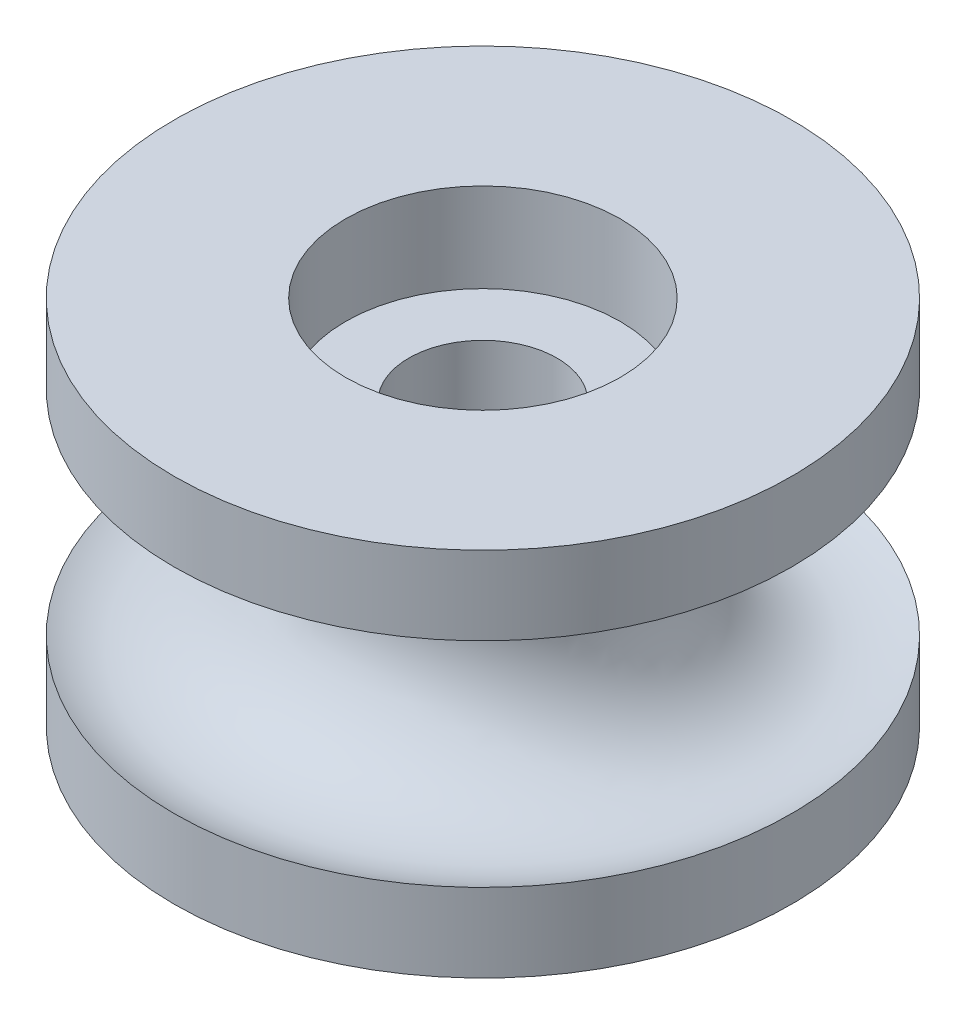
ISO-10303-21;
HEADER;
FILE_DESCRIPTION(('STEP AP214'),'2;1');
FILE_NAME('part.step','',(''),(''),'','','');
FILE_SCHEMA(('AUTOMOTIVE_DESIGN { 1 0 10303 214 1 1 1 1 }'));
ENDSEC;
DATA;
#1=APPLICATION_CONTEXT('core data for automotive mechanical design processes');
#2=APPLICATION_PROTOCOL_DEFINITION('international standard','automotive_design',2000,#1);
#3=PRODUCT_CONTEXT('',#1,'mechanical');
#4=PRODUCT('Part','Part','',(#3));
#5=PRODUCT_RELATED_PRODUCT_CATEGORY('part','',(#4));
#6=PRODUCT_DEFINITION_FORMATION('','',#4);
#7=PRODUCT_DEFINITION_CONTEXT('part definition',#1,'design');
#8=PRODUCT_DEFINITION('design','',#6,#7);
#9=PRODUCT_DEFINITION_SHAPE('','',#8);
#10=(LENGTH_UNIT() NAMED_UNIT(*) SI_UNIT(.MILLI.,.METRE.));
#11=(NAMED_UNIT(*) PLANE_ANGLE_UNIT() SI_UNIT($,.RADIAN.));
#12=(NAMED_UNIT(*) SI_UNIT($,.STERADIAN.) SOLID_ANGLE_UNIT());
#13=UNCERTAINTY_MEASURE_WITH_UNIT(LENGTH_MEASURE(1.E-05),#10,'distance_accuracy_value','');
#14=(GEOMETRIC_REPRESENTATION_CONTEXT(3) GLOBAL_UNCERTAINTY_ASSIGNED_CONTEXT((#13)) GLOBAL_UNIT_ASSIGNED_CONTEXT((#10,
#11,#12)) REPRESENTATION_CONTEXT('',''));
#15=CARTESIAN_POINT('',(0.,0.,0.));
#16=DIRECTION('',(0.,0.,1.));
#17=DIRECTION('',(1.,0.,0.));
#18=AXIS2_PLACEMENT_3D('',#15,#16,#17);
#19=CARTESIAN_POINT('',(0.,-15.,0.));
#20=DIRECTION('',(0.,1.,0.));
#21=DIRECTION('',(0.,0.,1.));
#22=AXIS2_PLACEMENT_3D('',#19,#20,#21);
#23=CYLINDRICAL_SURFACE('',#22,6.);
#24=CARTESIAN_POINT('',(0.,-7.8,0.));
#25=DIRECTION('',(0.,1.,0.));
#26=DIRECTION('',(0.,0.,1.));
#27=AXIS2_PLACEMENT_3D('',#24,#25,#26);
#28=CIRCLE('',#27,6.);
#29=CARTESIAN_POINT('',(0.,-7.8,6.));
#30=VERTEX_POINT('',#29);
#31=EDGE_CURVE('E35',#30,#30,#28,.F.);
#32=ORIENTED_EDGE('',*,*,#31,.T.);
#33=EDGE_LOOP('',(#32));
#34=FACE_BOUND('',#33,.T.);
#35=CARTESIAN_POINT('',(0.,7.8,0.));
#36=DIRECTION('',(0.,1.,0.));
#37=DIRECTION('',(0.,0.,1.));
#38=AXIS2_PLACEMENT_3D('',#35,#36,#37);
#39=CIRCLE('',#38,6.);
#40=CARTESIAN_POINT('',(0.,7.8,6.));
#41=VERTEX_POINT('',#40);
#42=EDGE_CURVE('E51',#41,#41,#39,.F.);
#43=ORIENTED_EDGE('',*,*,#42,.F.);
#44=EDGE_LOOP('',(#43));
#45=FACE_BOUND('',#44,.T.);
#46=ADVANCED_FACE('F31',(#34,#45),#23,.F.);
#47=CARTESIAN_POINT('',(0.,-15.,0.));
#48=DIRECTION('',(0.,1.,0.));
#49=DIRECTION('',(0.,0.,1.));
#50=AXIS2_PLACEMENT_3D('',#47,#48,#49);
#51=CYLINDRICAL_SURFACE('',#50,25.);
#52=CARTESIAN_POINT('',(0.,-8.64439847531337,0.));
#53=DIRECTION('',(0.,1.,0.));
#54=DIRECTION('',(0.,0.,1.));
#55=AXIS2_PLACEMENT_3D('',#52,#53,#54);
#56=CIRCLE('',#55,25.);
#57=CARTESIAN_POINT('',(0.,-8.64439847531337,25.));
#58=VERTEX_POINT('',#57);
#59=EDGE_CURVE('E44',#58,#58,#56,.T.);
#60=ORIENTED_EDGE('',*,*,#59,.F.);
#61=EDGE_LOOP('',(#60));
#62=FACE_BOUND('',#61,.T.);
#63=CARTESIAN_POINT('',(0.,-15.,0.));
#64=DIRECTION('',(0.,1.,0.));
#65=DIRECTION('',(0.,0.,1.));
#66=AXIS2_PLACEMENT_3D('',#63,#64,#65);
#67=CIRCLE('',#66,25.);
#68=CARTESIAN_POINT('',(0.,-15.,25.));
#69=VERTEX_POINT('',#68);
#70=EDGE_CURVE('E10',#69,#69,#67,.T.);
#71=ORIENTED_EDGE('',*,*,#70,.T.);
#72=EDGE_LOOP('',(#71));
#73=FACE_BOUND('',#72,.T.);
#74=ADVANCED_FACE('F91',(#62,#73),#51,.T.);
#75=CARTESIAN_POINT('',(0.,8.64439847531338,0.));
#76=DIRECTION('',(0.,-1.,0.));
#77=DIRECTION('',(0.,0.,-1.));
#78=AXIS2_PLACEMENT_3D('',#75,#76,#77);
#79=CIRCLE('',#78,25.);
#80=CARTESIAN_POINT('',(0.,8.64439847531337,-25.));
#81=VERTEX_POINT('',#80);
#82=EDGE_CURVE('E48',#81,#81,#79,.T.);
#83=ORIENTED_EDGE('',*,*,#82,.F.);
#84=EDGE_LOOP('',(#83));
#85=FACE_BOUND('',#84,.T.);
#86=CARTESIAN_POINT('',(0.,15.,0.));
#87=DIRECTION('',(0.,1.,0.));
#88=DIRECTION('',(0.,0.,1.));
#89=AXIS2_PLACEMENT_3D('',#86,#87,#88);
#90=CIRCLE('',#89,25.);
#91=CARTESIAN_POINT('',(0.,15.,25.));
#92=VERTEX_POINT('',#91);
#93=EDGE_CURVE('E39',#92,#92,#90,.T.);
#94=ORIENTED_EDGE('',*,*,#93,.F.);
#95=EDGE_LOOP('',(#94));
#96=FACE_BOUND('',#95,.T.);
#97=ADVANCED_FACE('F33',(#85,#96),#51,.T.);
#98=CARTESIAN_POINT('',(0.,-15.,0.));
#99=DIRECTION('',(0.,1.,0.));
#100=DIRECTION('',(0.,0.,1.));
#101=AXIS2_PLACEMENT_3D('',#98,#99,#100);
#102=PLANE('',#101);
#103=CARTESIAN_POINT('',(0.,-15.,0.));
#104=DIRECTION('',(0.,1.,0.));
#105=DIRECTION('',(0.,0.,1.));
#106=AXIS2_PLACEMENT_3D('',#103,#104,#105);
#107=CIRCLE('',#106,11.125);
#108=CARTESIAN_POINT('',(0.,-15.,11.125));
#109=VERTEX_POINT('',#108);
#110=EDGE_CURVE('E64',#109,#109,#107,.T.);
#111=ORIENTED_EDGE('',*,*,#110,.T.);
#112=EDGE_LOOP('',(#111));
#113=FACE_BOUND('',#112,.T.);
#114=ORIENTED_EDGE('',*,*,#70,.F.);
#115=EDGE_LOOP('',(#114));
#116=FACE_BOUND('',#115,.T.);
#117=ADVANCED_FACE('F100',(#113,#116),#102,.F.);
#118=CARTESIAN_POINT('',(0.,15.,0.));
#119=DIRECTION('',(0.,1.,0.));
#120=DIRECTION('',(0.,0.,1.));
#121=AXIS2_PLACEMENT_3D('',#118,#119,#120);
#122=PLANE('',#121);
#123=CARTESIAN_POINT('',(0.,15.,0.));
#124=DIRECTION('',(0.,1.,0.));
#125=DIRECTION('',(0.,0.,1.));
#126=AXIS2_PLACEMENT_3D('',#123,#124,#125);
#127=CIRCLE('',#126,11.125);
#128=CARTESIAN_POINT('',(0.,15.,11.125));
#129=VERTEX_POINT('',#128);
#130=EDGE_CURVE('E58',#129,#129,#127,.T.);
#131=ORIENTED_EDGE('',*,*,#130,.F.);
#132=EDGE_LOOP('',(#131));
#133=FACE_BOUND('',#132,.T.);
#134=ORIENTED_EDGE('',*,*,#93,.T.);
#135=EDGE_LOOP('',(#134));
#136=FACE_BOUND('',#135,.T.);
#137=ADVANCED_FACE('F98',(#133,#136),#122,.T.);
#138=CARTESIAN_POINT('',(0.,0.,0.));
#139=DIRECTION('',(0.,-1.,0.));
#140=DIRECTION('',(0.,0.,-1.));
#141=AXIS2_PLACEMENT_3D('',#138,#139,#140);
#142=TOROIDAL_SURFACE('',#141,21.,9.52500000000001);
#143=ORIENTED_EDGE('',*,*,#59,.T.);
#144=EDGE_LOOP('',(#143));
#145=FACE_BOUND('',#144,.T.);
#146=ORIENTED_EDGE('',*,*,#82,.T.);
#147=EDGE_LOOP('',(#146));
#148=FACE_BOUND('',#147,.T.);
#149=ADVANCED_FACE('F107',(#145,#148),#142,.F.);
#150=CARTESIAN_POINT('',(0.,7.8,0.));
#151=DIRECTION('',(0.,1.,0.));
#152=DIRECTION('',(0.,0.,1.));
#153=AXIS2_PLACEMENT_3D('',#150,#151,#152);
#154=PLANE('',#153);
#155=CARTESIAN_POINT('',(0.,7.8,0.));
#156=DIRECTION('',(0.,1.,0.));
#157=DIRECTION('',(0.,0.,1.));
#158=AXIS2_PLACEMENT_3D('',#155,#156,#157);
#159=CIRCLE('',#158,11.125);
#160=CARTESIAN_POINT('',(0.,7.8,11.125));
#161=VERTEX_POINT('',#160);
#162=EDGE_CURVE('E54',#161,#161,#159,.T.);
#163=ORIENTED_EDGE('',*,*,#162,.T.);
#164=EDGE_LOOP('',(#163));
#165=FACE_BOUND('',#164,.T.);
#166=ORIENTED_EDGE('',*,*,#42,.T.);
#167=EDGE_LOOP('',(#166));
#168=FACE_BOUND('',#167,.T.);
#169=ADVANCED_FACE('F87',(#165,#168),#154,.T.);
#170=CARTESIAN_POINT('',(0.,7.8,0.));
#171=DIRECTION('',(0.,1.,0.));
#172=DIRECTION('',(0.,0.,1.));
#173=AXIS2_PLACEMENT_3D('',#170,#171,#172);
#174=CYLINDRICAL_SURFACE('',#173,11.125);
#175=ORIENTED_EDGE('',*,*,#162,.F.);
#176=EDGE_LOOP('',(#175));
#177=FACE_BOUND('',#176,.T.);
#178=ORIENTED_EDGE('',*,*,#130,.T.);
#179=EDGE_LOOP('',(#178));
#180=FACE_BOUND('',#179,.T.);
#181=ADVANCED_FACE('F79',(#177,#180),#174,.F.);
#182=CARTESIAN_POINT('',(0.,-7.8,0.));
#183=DIRECTION('',(0.,1.,0.));
#184=DIRECTION('',(0.,0.,1.));
#185=AXIS2_PLACEMENT_3D('',#182,#183,#184);
#186=PLANE('',#185);
#187=CARTESIAN_POINT('',(0.,-7.8,0.));
#188=DIRECTION('',(0.,1.,0.));
#189=DIRECTION('',(0.,0.,1.));
#190=AXIS2_PLACEMENT_3D('',#187,#188,#189);
#191=CIRCLE('',#190,11.125);
#192=CARTESIAN_POINT('',(0.,-7.8,11.125));
#193=VERTEX_POINT('',#192);
#194=EDGE_CURVE('E67',#193,#193,#191,.T.);
#195=ORIENTED_EDGE('',*,*,#194,.F.);
#196=EDGE_LOOP('',(#195));
#197=FACE_BOUND('',#196,.T.);
#198=ORIENTED_EDGE('',*,*,#31,.F.);
#199=EDGE_LOOP('',(#198));
#200=FACE_BOUND('',#199,.T.);
#201=ADVANCED_FACE('F76',(#197,#200),#186,.F.);
#202=CARTESIAN_POINT('',(0.,-7.8,0.));
#203=DIRECTION('',(0.,-1.,0.));
#204=DIRECTION('',(0.,0.,-1.));
#205=AXIS2_PLACEMENT_3D('',#202,#203,#204);
#206=CYLINDRICAL_SURFACE('',#205,11.125);
#207=ORIENTED_EDGE('',*,*,#194,.T.);
#208=EDGE_LOOP('',(#207));
#209=FACE_BOUND('',#208,.T.);
#210=ORIENTED_EDGE('',*,*,#110,.F.);
#211=EDGE_LOOP('',(#210));
#212=FACE_BOUND('',#211,.T.);
#213=ADVANCED_FACE('F78',(#209,#212),#206,.F.);
#214=CLOSED_SHELL('',(#46,#74,#97,#117,#137,#149,#169,#181,#201,#213));
#215=MANIFOLD_SOLID_BREP('B2',#214);
#216=ADVANCED_BREP_SHAPE_REPRESENTATION('',(#18,#215),#14);
#217=SHAPE_DEFINITION_REPRESENTATION(#9,#216);
ENDSEC;
END-ISO-10303-21;
